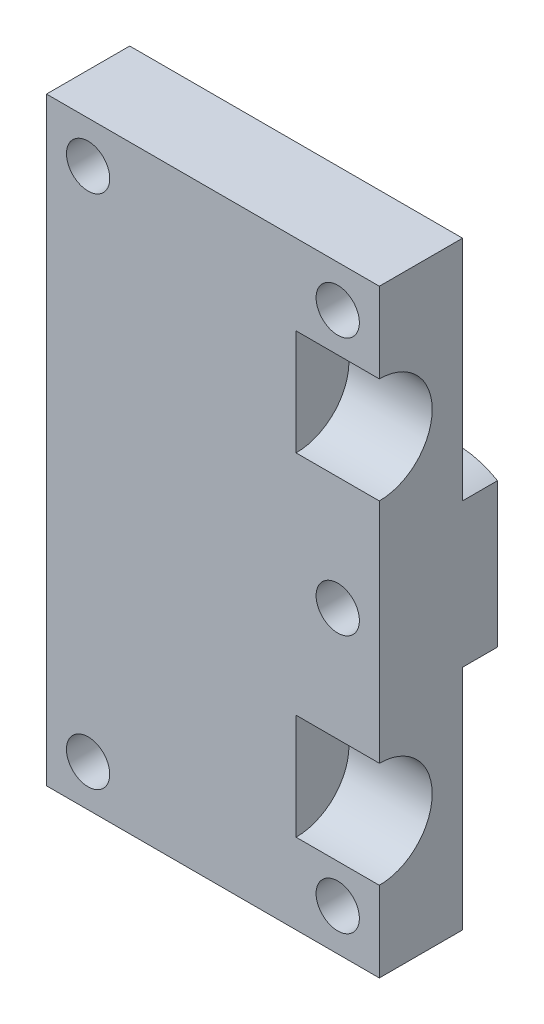
ISO-10303-21;
HEADER;
FILE_DESCRIPTION(('STEP AP214'),'2;1');
FILE_NAME('part.step','',(''),(''),'','','');
FILE_SCHEMA(('AUTOMOTIVE_DESIGN { 1 0 10303 214 1 1 1 1 }'));
ENDSEC;
DATA;
#1=APPLICATION_CONTEXT('core data for automotive mechanical design processes');
#2=APPLICATION_PROTOCOL_DEFINITION('international standard','automotive_design',2000,#1);
#3=PRODUCT_CONTEXT('',#1,'mechanical');
#4=PRODUCT('Part','Part','',(#3));
#5=PRODUCT_RELATED_PRODUCT_CATEGORY('part','',(#4));
#6=PRODUCT_DEFINITION_FORMATION('','',#4);
#7=PRODUCT_DEFINITION_CONTEXT('part definition',#1,'design');
#8=PRODUCT_DEFINITION('design','',#6,#7);
#9=PRODUCT_DEFINITION_SHAPE('','',#8);
#10=(LENGTH_UNIT() NAMED_UNIT(*) SI_UNIT(.MILLI.,.METRE.));
#11=(NAMED_UNIT(*) PLANE_ANGLE_UNIT() SI_UNIT($,.RADIAN.));
#12=(NAMED_UNIT(*) SI_UNIT($,.STERADIAN.) SOLID_ANGLE_UNIT());
#13=UNCERTAINTY_MEASURE_WITH_UNIT(LENGTH_MEASURE(1.E-05),#10,'distance_accuracy_value','');
#14=(GEOMETRIC_REPRESENTATION_CONTEXT(3) GLOBAL_UNCERTAINTY_ASSIGNED_CONTEXT((#13)) GLOBAL_UNIT_ASSIGNED_CONTEXT((#10,
#11,#12)) REPRESENTATION_CONTEXT('',''));
#15=CARTESIAN_POINT('',(0.,0.,0.));
#16=DIRECTION('',(0.,0.,1.));
#17=DIRECTION('',(1.,0.,0.));
#18=AXIS2_PLACEMENT_3D('',#15,#16,#17);
#19=CARTESIAN_POINT('',(0.,36.,0.));
#20=DIRECTION('',(1.,0.,0.));
#21=DIRECTION('',(0.,0.,-1.));
#22=AXIS2_PLACEMENT_3D('',#19,#20,#21);
#23=PLANE('',#22);
#24=DIRECTION('',(0.,0.,1.));
#25=VECTOR('',#24,1.);
#26=CARTESIAN_POINT('',(0.,-36.,0.));
#27=LINE('',#26,#25);
#28=CARTESIAN_POINT('',(0.,-36.,-10.));
#29=VERTEX_POINT('',#28);
#30=CARTESIAN_POINT('',(0.,-36.,0.));
#31=VERTEX_POINT('',#30);
#32=EDGE_CURVE('E181',#29,#31,#27,.T.);
#33=ORIENTED_EDGE('',*,*,#32,.T.);
#34=DIRECTION('',(0.,-1.,0.));
#35=VECTOR('',#34,1.);
#36=CARTESIAN_POINT('',(0.,36.,0.));
#37=LINE('',#36,#35);
#38=CARTESIAN_POINT('',(0.,36.,0.));
#39=VERTEX_POINT('',#38);
#40=EDGE_CURVE('E11',#39,#31,#37,.T.);
#41=ORIENTED_EDGE('',*,*,#40,.F.);
#42=DIRECTION('',(0.,0.,1.));
#43=VECTOR('',#42,1.);
#44=CARTESIAN_POINT('',(0.,36.,0.));
#45=LINE('',#44,#43);
#46=CARTESIAN_POINT('',(0.,36.,-10.));
#47=VERTEX_POINT('',#46);
#48=EDGE_CURVE('E184',#47,#39,#45,.T.);
#49=ORIENTED_EDGE('',*,*,#48,.F.);
#50=DIRECTION('',(0.,-1.,0.));
#51=VECTOR('',#50,1.);
#52=CARTESIAN_POINT('',(0.,36.,-10.));
#53=LINE('',#52,#51);
#54=EDGE_CURVE('E194',#47,#29,#53,.T.);
#55=ORIENTED_EDGE('',*,*,#54,.T.);
#56=EDGE_LOOP('',(#33,#41,#49,#55));
#57=FACE_BOUND('',#56,.T.);
#58=ADVANCED_FACE('F33',(#57),#23,.F.);
#59=CARTESIAN_POINT('',(0.,36.,0.));
#60=DIRECTION('',(0.,0.,-1.));
#61=DIRECTION('',(-1.,0.,0.));
#62=AXIS2_PLACEMENT_3D('',#59,#60,#61);
#63=PLANE('',#62);
#64=CARTESIAN_POINT('',(35.,0.,0.));
#65=DIRECTION('',(0.,0.,-1.));
#66=DIRECTION('',(-1.,0.,0.));
#67=AXIS2_PLACEMENT_3D('',#64,#65,#66);
#68=CIRCLE('',#67,2.6);
#69=CARTESIAN_POINT('',(32.4,0.,0.));
#70=VERTEX_POINT('',#69);
#71=EDGE_CURVE('E127',#70,#70,#68,.T.);
#72=ORIENTED_EDGE('',*,*,#71,.T.);
#73=EDGE_LOOP('',(#72));
#74=FACE_BOUND('',#73,.T.);
#75=CARTESIAN_POINT('',(5.,-31.,0.));
#76=DIRECTION('',(0.,0.,-1.));
#77=DIRECTION('',(-1.,0.,0.));
#78=AXIS2_PLACEMENT_3D('',#75,#76,#77);
#79=CIRCLE('',#78,2.6);
#80=CARTESIAN_POINT('',(2.4,-31.,0.));
#81=VERTEX_POINT('',#80);
#82=EDGE_CURVE('E135',#81,#81,#79,.T.);
#83=ORIENTED_EDGE('',*,*,#82,.T.);
#84=EDGE_LOOP('',(#83));
#85=FACE_BOUND('',#84,.T.);
#86=CARTESIAN_POINT('',(35.,-31.,0.));
#87=DIRECTION('',(0.,0.,-1.));
#88=DIRECTION('',(-1.,0.,0.));
#89=AXIS2_PLACEMENT_3D('',#86,#87,#88);
#90=CIRCLE('',#89,2.6);
#91=CARTESIAN_POINT('',(32.4,-31.,0.));
#92=VERTEX_POINT('',#91);
#93=EDGE_CURVE('E148',#92,#92,#90,.T.);
#94=ORIENTED_EDGE('',*,*,#93,.T.);
#95=EDGE_LOOP('',(#94));
#96=FACE_BOUND('',#95,.T.);
#97=CARTESIAN_POINT('',(5.,31.,0.));
#98=DIRECTION('',(0.,0.,-1.));
#99=DIRECTION('',(-1.,0.,0.));
#100=AXIS2_PLACEMENT_3D('',#97,#98,#99);
#101=CIRCLE('',#100,2.6);
#102=CARTESIAN_POINT('',(2.4,31.,0.));
#103=VERTEX_POINT('',#102);
#104=EDGE_CURVE('E141',#103,#103,#101,.T.);
#105=ORIENTED_EDGE('',*,*,#104,.T.);
#106=EDGE_LOOP('',(#105));
#107=FACE_BOUND('',#106,.T.);
#108=CARTESIAN_POINT('',(35.,31.,0.));
#109=DIRECTION('',(0.,0.,-1.));
#110=DIRECTION('',(-1.,0.,0.));
#111=AXIS2_PLACEMENT_3D('',#108,#109,#110);
#112=CIRCLE('',#111,2.6);
#113=CARTESIAN_POINT('',(32.4,31.,0.));
#114=VERTEX_POINT('',#113);
#115=EDGE_CURVE('E153',#114,#114,#112,.T.);
#116=ORIENTED_EDGE('',*,*,#115,.T.);
#117=EDGE_LOOP('',(#116));
#118=FACE_BOUND('',#117,.T.);
#119=DIRECTION('',(0.,-1.,0.));
#120=VECTOR('',#119,1.);
#121=CARTESIAN_POINT('',(30.,-13.65,0.));
#122=LINE('',#121,#120);
#123=CARTESIAN_POINT('',(30.,-13.65,0.));
#124=VERTEX_POINT('',#123);
#125=CARTESIAN_POINT('',(30.,-26.35,0.));
#126=VERTEX_POINT('',#125);
#127=EDGE_CURVE('E162',#124,#126,#122,.T.);
#128=ORIENTED_EDGE('',*,*,#127,.F.);
#129=DIRECTION('',(1.,0.,0.));
#130=VECTOR('',#129,1.);
#131=CARTESIAN_POINT('',(30.,-13.65,0.));
#132=LINE('',#131,#130);
#133=CARTESIAN_POINT('',(40.,-13.65,0.));
#134=VERTEX_POINT('',#133);
#135=EDGE_CURVE('E165',#124,#134,#132,.T.);
#136=ORIENTED_EDGE('',*,*,#135,.T.);
#137=DIRECTION('',(0.,-1.,0.));
#138=VECTOR('',#137,1.);
#139=CARTESIAN_POINT('',(40.,36.,0.));
#140=LINE('',#139,#138);
#141=CARTESIAN_POINT('',(40.,13.65,0.));
#142=VERTEX_POINT('',#141);
#143=EDGE_CURVE('E210',#142,#134,#140,.T.);
#144=ORIENTED_EDGE('',*,*,#143,.F.);
#145=DIRECTION('',(1.,0.,0.));
#146=VECTOR('',#145,1.);
#147=CARTESIAN_POINT('',(30.,13.65,0.));
#148=LINE('',#147,#146);
#149=CARTESIAN_POINT('',(30.,13.65,0.));
#150=VERTEX_POINT('',#149);
#151=EDGE_CURVE('E179',#150,#142,#148,.T.);
#152=ORIENTED_EDGE('',*,*,#151,.F.);
#153=DIRECTION('',(0.,-1.,0.));
#154=VECTOR('',#153,1.);
#155=CARTESIAN_POINT('',(30.,26.35,0.));
#156=LINE('',#155,#154);
#157=CARTESIAN_POINT('',(30.,26.35,0.));
#158=VERTEX_POINT('',#157);
#159=EDGE_CURVE('E174',#158,#150,#156,.T.);
#160=ORIENTED_EDGE('',*,*,#159,.F.);
#161=DIRECTION('',(1.,0.,0.));
#162=VECTOR('',#161,1.);
#163=CARTESIAN_POINT('',(30.,26.35,0.));
#164=LINE('',#163,#162);
#165=CARTESIAN_POINT('',(40.,26.35,0.));
#166=VERTEX_POINT('',#165);
#167=EDGE_CURVE('E177',#158,#166,#164,.T.);
#168=ORIENTED_EDGE('',*,*,#167,.T.);
#169=CARTESIAN_POINT('',(40.,36.,0.));
#170=VERTEX_POINT('',#169);
#171=EDGE_CURVE('E40',#170,#166,#140,.T.);
#172=ORIENTED_EDGE('',*,*,#171,.F.);
#173=DIRECTION('',(1.,0.,0.));
#174=VECTOR('',#173,1.);
#175=CARTESIAN_POINT('',(0.,36.,0.));
#176=LINE('',#175,#174);
#177=EDGE_CURVE('E187',#39,#170,#176,.T.);
#178=ORIENTED_EDGE('',*,*,#177,.F.);
#179=ORIENTED_EDGE('',*,*,#40,.T.);
#180=DIRECTION('',(1.,0.,0.));
#181=VECTOR('',#180,1.);
#182=CARTESIAN_POINT('',(0.,-36.,0.));
#183=LINE('',#182,#181);
#184=CARTESIAN_POINT('',(40.,-36.,0.));
#185=VERTEX_POINT('',#184);
#186=EDGE_CURVE('E197',#31,#185,#183,.T.);
#187=ORIENTED_EDGE('',*,*,#186,.T.);
#188=CARTESIAN_POINT('',(40.,-26.35,0.));
#189=VERTEX_POINT('',#188);
#190=EDGE_CURVE('E208',#189,#185,#140,.T.);
#191=ORIENTED_EDGE('',*,*,#190,.F.);
#192=DIRECTION('',(1.,0.,0.));
#193=VECTOR('',#192,1.);
#194=CARTESIAN_POINT('',(30.,-26.35,0.));
#195=LINE('',#194,#193);
#196=EDGE_CURVE('E55',#126,#189,#195,.T.);
#197=ORIENTED_EDGE('',*,*,#196,.F.);
#198=EDGE_LOOP('',(#128,#136,#144,#152,#160,#168,#172,#178,#179,#187,#191,#197));
#199=FACE_BOUND('',#198,.T.);
#200=ADVANCED_FACE('F219',(#74,#85,#96,#107,#118,#199),#63,.F.);
#201=CARTESIAN_POINT('',(40.,36.,0.));
#202=DIRECTION('',(-1.,0.,0.));
#203=DIRECTION('',(0.,0.,1.));
#204=AXIS2_PLACEMENT_3D('',#201,#202,#203);
#205=PLANE('',#204);
#206=ORIENTED_EDGE('',*,*,#143,.T.);
#207=CARTESIAN_POINT('',(40.,-20.,0.));
#208=DIRECTION('',(1.,0.,0.));
#209=DIRECTION('',(0.,0.,-1.));
#210=AXIS2_PLACEMENT_3D('',#207,#208,#209);
#211=CIRCLE('',#210,6.35);
#212=EDGE_CURVE('E156',#189,#134,#211,.T.);
#213=ORIENTED_EDGE('',*,*,#212,.F.);
#214=ORIENTED_EDGE('',*,*,#190,.T.);
#215=DIRECTION('',(0.,0.,-1.));
#216=VECTOR('',#215,1.);
#217=CARTESIAN_POINT('',(40.,-36.,0.));
#218=LINE('',#217,#216);
#219=CARTESIAN_POINT('',(40.,-36.,-10.));
#220=VERTEX_POINT('',#219);
#221=EDGE_CURVE('E200',#185,#220,#218,.T.);
#222=ORIENTED_EDGE('',*,*,#221,.T.);
#223=DIRECTION('',(0.,-1.,0.));
#224=VECTOR('',#223,1.);
#225=CARTESIAN_POINT('',(40.,36.,-10.));
#226=LINE('',#225,#224);
#227=CARTESIAN_POINT('',(40.,-8.66025403784439,-10.));
#228=VERTEX_POINT('',#227);
#229=EDGE_CURVE('E206',#228,#220,#226,.T.);
#230=ORIENTED_EDGE('',*,*,#229,.F.);
#231=DIRECTION('',(0.,0.,1.));
#232=VECTOR('',#231,1.);
#233=CARTESIAN_POINT('',(40.,-8.66025403784439,-14.2));
#234=LINE('',#233,#232);
#235=CARTESIAN_POINT('',(40.,-8.66025403784439,-14.2));
#236=VERTEX_POINT('',#235);
#237=EDGE_CURVE('E117',#236,#228,#234,.T.);
#238=ORIENTED_EDGE('',*,*,#237,.F.);
#239=DIRECTION('',(0.,-1.,0.));
#240=VECTOR('',#239,1.);
#241=CARTESIAN_POINT('',(40.,8.66025403784439,-14.2));
#242=LINE('',#241,#240);
#243=CARTESIAN_POINT('',(40.,8.66025403784439,-14.2));
#244=VERTEX_POINT('',#243);
#245=EDGE_CURVE('E109',#244,#236,#242,.T.);
#246=ORIENTED_EDGE('',*,*,#245,.F.);
#247=DIRECTION('',(0.,0.,1.));
#248=VECTOR('',#247,1.);
#249=CARTESIAN_POINT('',(40.,8.66025403784439,-14.2));
#250=LINE('',#249,#248);
#251=CARTESIAN_POINT('',(40.,8.66025403784439,-10.));
#252=VERTEX_POINT('',#251);
#253=EDGE_CURVE('E115',#244,#252,#250,.T.);
#254=ORIENTED_EDGE('',*,*,#253,.T.);
#255=CARTESIAN_POINT('',(40.,36.,-10.));
#256=VERTEX_POINT('',#255);
#257=EDGE_CURVE('E207',#256,#252,#226,.T.);
#258=ORIENTED_EDGE('',*,*,#257,.F.);
#259=DIRECTION('',(0.,0.,-1.));
#260=VECTOR('',#259,1.);
#261=CARTESIAN_POINT('',(40.,36.,0.));
#262=LINE('',#261,#260);
#263=EDGE_CURVE('E190',#170,#256,#262,.T.);
#264=ORIENTED_EDGE('',*,*,#263,.F.);
#265=ORIENTED_EDGE('',*,*,#171,.T.);
#266=CARTESIAN_POINT('',(40.,20.,0.));
#267=DIRECTION('',(1.,0.,0.));
#268=DIRECTION('',(0.,0.,-1.));
#269=AXIS2_PLACEMENT_3D('',#266,#267,#268);
#270=CIRCLE('',#269,6.35);
#271=EDGE_CURVE('E168',#142,#166,#270,.T.);
#272=ORIENTED_EDGE('',*,*,#271,.F.);
#273=EDGE_LOOP('',(#206,#213,#214,#222,#230,#238,#246,#254,#258,#264,#265,#272));
#274=FACE_BOUND('',#273,.T.);
#275=ADVANCED_FACE('F112',(#274),#205,.F.);
#276=CARTESIAN_POINT('',(0.,36.,-10.));
#277=DIRECTION('',(0.,0.,1.));
#278=DIRECTION('',(1.,0.,0.));
#279=AXIS2_PLACEMENT_3D('',#276,#277,#278);
#280=PLANE('',#279);
#281=CARTESIAN_POINT('',(35.,0.,-10.));
#282=DIRECTION('',(0.,0.,-1.));
#283=DIRECTION('',(-1.,0.,0.));
#284=AXIS2_PLACEMENT_3D('',#281,#282,#283);
#285=CIRCLE('',#284,10.);
#286=EDGE_CURVE('E47',#228,#252,#285,.T.);
#287=ORIENTED_EDGE('',*,*,#286,.F.);
#288=ORIENTED_EDGE('',*,*,#229,.T.);
#289=DIRECTION('',(-1.,0.,0.));
#290=VECTOR('',#289,1.);
#291=CARTESIAN_POINT('',(0.,-36.,-10.));
#292=LINE('',#291,#290);
#293=EDGE_CURVE('E188',#220,#29,#292,.T.);
#294=ORIENTED_EDGE('',*,*,#293,.T.);
#295=ORIENTED_EDGE('',*,*,#54,.F.);
#296=DIRECTION('',(-1.,0.,0.));
#297=VECTOR('',#296,1.);
#298=CARTESIAN_POINT('',(0.,36.,-10.));
#299=LINE('',#298,#297);
#300=EDGE_CURVE('E192',#256,#47,#299,.T.);
#301=ORIENTED_EDGE('',*,*,#300,.F.);
#302=ORIENTED_EDGE('',*,*,#257,.T.);
#303=EDGE_LOOP('',(#287,#288,#294,#295,#301,#302));
#304=FACE_BOUND('',#303,.T.);
#305=CARTESIAN_POINT('',(5.,-31.,-10.));
#306=DIRECTION('',(0.,0.,-1.));
#307=DIRECTION('',(-1.,0.,0.));
#308=AXIS2_PLACEMENT_3D('',#305,#306,#307);
#309=CIRCLE('',#308,2.6);
#310=CARTESIAN_POINT('',(2.4,-31.,-10.));
#311=VERTEX_POINT('',#310);
#312=EDGE_CURVE('E130',#311,#311,#309,.T.);
#313=ORIENTED_EDGE('',*,*,#312,.F.);
#314=EDGE_LOOP('',(#313));
#315=FACE_BOUND('',#314,.T.);
#316=CARTESIAN_POINT('',(35.,-31.,-10.));
#317=DIRECTION('',(0.,0.,-1.));
#318=DIRECTION('',(-1.,0.,0.));
#319=AXIS2_PLACEMENT_3D('',#316,#317,#318);
#320=CIRCLE('',#319,2.6);
#321=CARTESIAN_POINT('',(32.4,-31.,-10.));
#322=VERTEX_POINT('',#321);
#323=EDGE_CURVE('E138',#322,#322,#320,.T.);
#324=ORIENTED_EDGE('',*,*,#323,.F.);
#325=EDGE_LOOP('',(#324));
#326=FACE_BOUND('',#325,.T.);
#327=CARTESIAN_POINT('',(5.,31.,-10.));
#328=DIRECTION('',(0.,0.,-1.));
#329=DIRECTION('',(-1.,0.,0.));
#330=AXIS2_PLACEMENT_3D('',#327,#328,#329);
#331=CIRCLE('',#330,2.6);
#332=CARTESIAN_POINT('',(2.4,31.,-10.));
#333=VERTEX_POINT('',#332);
#334=EDGE_CURVE('E145',#333,#333,#331,.T.);
#335=ORIENTED_EDGE('',*,*,#334,.F.);
#336=EDGE_LOOP('',(#335));
#337=FACE_BOUND('',#336,.T.);
#338=CARTESIAN_POINT('',(35.,31.,-10.));
#339=DIRECTION('',(0.,0.,-1.));
#340=DIRECTION('',(-1.,0.,0.));
#341=AXIS2_PLACEMENT_3D('',#338,#339,#340);
#342=CIRCLE('',#341,2.6);
#343=CARTESIAN_POINT('',(32.4,31.,-10.));
#344=VERTEX_POINT('',#343);
#345=EDGE_CURVE('E144',#344,#344,#342,.T.);
#346=ORIENTED_EDGE('',*,*,#345,.F.);
#347=EDGE_LOOP('',(#346));
#348=FACE_BOUND('',#347,.T.);
#349=ADVANCED_FACE('F225',(#304,#315,#326,#337,#348),#280,.F.);
#350=CARTESIAN_POINT('',(0.,36.,0.));
#351=DIRECTION('',(0.,-1.,0.));
#352=DIRECTION('',(0.,0.,-1.));
#353=AXIS2_PLACEMENT_3D('',#350,#351,#352);
#354=PLANE('',#353);
#355=ORIENTED_EDGE('',*,*,#48,.T.);
#356=ORIENTED_EDGE('',*,*,#177,.T.);
#357=ORIENTED_EDGE('',*,*,#263,.T.);
#358=ORIENTED_EDGE('',*,*,#300,.T.);
#359=EDGE_LOOP('',(#355,#356,#357,#358));
#360=FACE_BOUND('',#359,.T.);
#361=ADVANCED_FACE('F231',(#360),#354,.F.);
#362=CARTESIAN_POINT('',(0.,-36.,0.));
#363=DIRECTION('',(0.,-1.,0.));
#364=DIRECTION('',(0.,0.,-1.));
#365=AXIS2_PLACEMENT_3D('',#362,#363,#364);
#366=PLANE('',#365);
#367=ORIENTED_EDGE('',*,*,#32,.F.);
#368=ORIENTED_EDGE('',*,*,#293,.F.);
#369=ORIENTED_EDGE('',*,*,#221,.F.);
#370=ORIENTED_EDGE('',*,*,#186,.F.);
#371=EDGE_LOOP('',(#367,#368,#369,#370));
#372=FACE_BOUND('',#371,.T.);
#373=ADVANCED_FACE('F223',(#372),#366,.T.);
#374=CARTESIAN_POINT('',(30.,20.,0.));
#375=DIRECTION('',(1.,0.,0.));
#376=DIRECTION('',(0.,0.,-1.));
#377=AXIS2_PLACEMENT_3D('',#374,#375,#376);
#378=CYLINDRICAL_SURFACE('',#377,6.35);
#379=ORIENTED_EDGE('',*,*,#271,.T.);
#380=ORIENTED_EDGE('',*,*,#167,.F.);
#381=CARTESIAN_POINT('',(30.,20.,0.));
#382=DIRECTION('',(1.,0.,0.));
#383=DIRECTION('',(0.,0.,-1.));
#384=AXIS2_PLACEMENT_3D('',#381,#382,#383);
#385=CIRCLE('',#384,6.35);
#386=EDGE_CURVE('E171',#150,#158,#385,.T.);
#387=ORIENTED_EDGE('',*,*,#386,.F.);
#388=ORIENTED_EDGE('',*,*,#151,.T.);
#389=EDGE_LOOP('',(#379,#380,#387,#388));
#390=FACE_BOUND('',#389,.T.);
#391=ADVANCED_FACE('F235',(#390),#378,.F.);
#392=CARTESIAN_POINT('',(30.,20.,0.));
#393=DIRECTION('',(1.,0.,0.));
#394=DIRECTION('',(0.,0.,-1.));
#395=AXIS2_PLACEMENT_3D('',#392,#393,#394);
#396=PLANE('',#395);
#397=ORIENTED_EDGE('',*,*,#386,.T.);
#398=ORIENTED_EDGE('',*,*,#159,.T.);
#399=EDGE_LOOP('',(#397,#398));
#400=FACE_BOUND('',#399,.T.);
#401=ADVANCED_FACE('F237',(#400),#396,.T.);
#402=CARTESIAN_POINT('',(30.,-20.,0.));
#403=DIRECTION('',(1.,0.,0.));
#404=DIRECTION('',(0.,0.,-1.));
#405=AXIS2_PLACEMENT_3D('',#402,#403,#404);
#406=CYLINDRICAL_SURFACE('',#405,6.35);
#407=ORIENTED_EDGE('',*,*,#212,.T.);
#408=ORIENTED_EDGE('',*,*,#135,.F.);
#409=CARTESIAN_POINT('',(30.,-20.,0.));
#410=DIRECTION('',(1.,0.,0.));
#411=DIRECTION('',(0.,0.,-1.));
#412=AXIS2_PLACEMENT_3D('',#409,#410,#411);
#413=CIRCLE('',#412,6.35);
#414=EDGE_CURVE('E159',#126,#124,#413,.T.);
#415=ORIENTED_EDGE('',*,*,#414,.F.);
#416=ORIENTED_EDGE('',*,*,#196,.T.);
#417=EDGE_LOOP('',(#407,#408,#415,#416));
#418=FACE_BOUND('',#417,.T.);
#419=ADVANCED_FACE('F239',(#418),#406,.F.);
#420=CARTESIAN_POINT('',(30.,-20.,0.));
#421=DIRECTION('',(1.,0.,0.));
#422=DIRECTION('',(0.,0.,-1.));
#423=AXIS2_PLACEMENT_3D('',#420,#421,#422);
#424=PLANE('',#423);
#425=ORIENTED_EDGE('',*,*,#414,.T.);
#426=ORIENTED_EDGE('',*,*,#127,.T.);
#427=EDGE_LOOP('',(#425,#426));
#428=FACE_BOUND('',#427,.T.);
#429=ADVANCED_FACE('F241',(#428),#424,.T.);
#430=CARTESIAN_POINT('',(35.,31.,0.));
#431=DIRECTION('',(0.,0.,-1.));
#432=DIRECTION('',(-1.,0.,0.));
#433=AXIS2_PLACEMENT_3D('',#430,#431,#432);
#434=CYLINDRICAL_SURFACE('',#433,2.6);
#435=ORIENTED_EDGE('',*,*,#115,.F.);
#436=EDGE_LOOP('',(#435));
#437=FACE_BOUND('',#436,.T.);
#438=ORIENTED_EDGE('',*,*,#345,.T.);
#439=EDGE_LOOP('',(#438));
#440=FACE_BOUND('',#439,.T.);
#441=ADVANCED_FACE('F243',(#437,#440),#434,.F.);
#442=CARTESIAN_POINT('',(5.,31.,0.));
#443=DIRECTION('',(0.,0.,-1.));
#444=DIRECTION('',(-1.,0.,0.));
#445=AXIS2_PLACEMENT_3D('',#442,#443,#444);
#446=CYLINDRICAL_SURFACE('',#445,2.6);
#447=ORIENTED_EDGE('',*,*,#104,.F.);
#448=EDGE_LOOP('',(#447));
#449=FACE_BOUND('',#448,.T.);
#450=ORIENTED_EDGE('',*,*,#334,.T.);
#451=EDGE_LOOP('',(#450));
#452=FACE_BOUND('',#451,.T.);
#453=ADVANCED_FACE('F249',(#449,#452),#446,.F.);
#454=CARTESIAN_POINT('',(35.,-31.,0.));
#455=DIRECTION('',(0.,0.,-1.));
#456=DIRECTION('',(-1.,0.,0.));
#457=AXIS2_PLACEMENT_3D('',#454,#455,#456);
#458=CYLINDRICAL_SURFACE('',#457,2.6);
#459=ORIENTED_EDGE('',*,*,#93,.F.);
#460=EDGE_LOOP('',(#459));
#461=FACE_BOUND('',#460,.T.);
#462=ORIENTED_EDGE('',*,*,#323,.T.);
#463=EDGE_LOOP('',(#462));
#464=FACE_BOUND('',#463,.T.);
#465=ADVANCED_FACE('F300',(#461,#464),#458,.F.);
#466=CARTESIAN_POINT('',(5.,-31.,0.));
#467=DIRECTION('',(0.,0.,-1.));
#468=DIRECTION('',(-1.,0.,0.));
#469=AXIS2_PLACEMENT_3D('',#466,#467,#468);
#470=CYLINDRICAL_SURFACE('',#469,2.6);
#471=ORIENTED_EDGE('',*,*,#82,.F.);
#472=EDGE_LOOP('',(#471));
#473=FACE_BOUND('',#472,.T.);
#474=ORIENTED_EDGE('',*,*,#312,.T.);
#475=EDGE_LOOP('',(#474));
#476=FACE_BOUND('',#475,.T.);
#477=ADVANCED_FACE('F309',(#473,#476),#470,.F.);
#478=CARTESIAN_POINT('',(35.,0.,0.));
#479=DIRECTION('',(0.,0.,-1.));
#480=DIRECTION('',(-1.,0.,0.));
#481=AXIS2_PLACEMENT_3D('',#478,#479,#480);
#482=CYLINDRICAL_SURFACE('',#481,2.6);
#483=ORIENTED_EDGE('',*,*,#71,.F.);
#484=EDGE_LOOP('',(#483));
#485=FACE_BOUND('',#484,.T.);
#486=CARTESIAN_POINT('',(35.,0.,-14.2));
#487=DIRECTION('',(0.,0.,-1.));
#488=DIRECTION('',(-1.,0.,0.));
#489=AXIS2_PLACEMENT_3D('',#486,#487,#488);
#490=CIRCLE('',#489,2.6);
#491=CARTESIAN_POINT('',(32.4,0.,-14.2));
#492=VERTEX_POINT('',#491);
#493=EDGE_CURVE('E398',#492,#492,#490,.T.);
#494=ORIENTED_EDGE('',*,*,#493,.T.);
#495=EDGE_LOOP('',(#494));
#496=FACE_BOUND('',#495,.T.);
#497=ADVANCED_FACE('F318',(#485,#496),#482,.F.);
#498=CARTESIAN_POINT('',(35.,0.,-14.2));
#499=DIRECTION('',(0.,0.,-1.));
#500=DIRECTION('',(-1.,0.,0.));
#501=AXIS2_PLACEMENT_3D('',#498,#499,#500);
#502=PLANE('',#501);
#503=CARTESIAN_POINT('',(35.,0.,-14.2));
#504=DIRECTION('',(0.,0.,-1.));
#505=DIRECTION('',(-1.,0.,0.));
#506=AXIS2_PLACEMENT_3D('',#503,#504,#505);
#507=CIRCLE('',#506,10.);
#508=EDGE_CURVE('E120',#236,#244,#507,.T.);
#509=ORIENTED_EDGE('',*,*,#508,.T.);
#510=ORIENTED_EDGE('',*,*,#245,.T.);
#511=EDGE_LOOP('',(#509,#510));
#512=FACE_BOUND('',#511,.T.);
#513=ORIENTED_EDGE('',*,*,#493,.F.);
#514=EDGE_LOOP('',(#513));
#515=FACE_BOUND('',#514,.T.);
#516=ADVANCED_FACE('F122',(#512,#515),#502,.T.);
#517=CARTESIAN_POINT('',(35.,0.,-14.2));
#518=DIRECTION('',(0.,0.,1.));
#519=DIRECTION('',(1.,0.,0.));
#520=AXIS2_PLACEMENT_3D('',#517,#518,#519);
#521=CYLINDRICAL_SURFACE('',#520,10.);
#522=ORIENTED_EDGE('',*,*,#286,.T.);
#523=ORIENTED_EDGE('',*,*,#253,.F.);
#524=ORIENTED_EDGE('',*,*,#508,.F.);
#525=ORIENTED_EDGE('',*,*,#237,.T.);
#526=EDGE_LOOP('',(#522,#523,#524,#525));
#527=FACE_BOUND('',#526,.T.);
#528=ADVANCED_FACE('F126',(#527),#521,.T.);
#529=CLOSED_SHELL('',(#58,#200,#275,#349,#361,#373,#391,#401,#419,#429,#441,#453,#465,#477,#497,
#516,#528));
#530=MANIFOLD_SOLID_BREP('B2',#529);
#531=ADVANCED_BREP_SHAPE_REPRESENTATION('',(#18,#530),#14);
#532=SHAPE_DEFINITION_REPRESENTATION(#9,#531);
ENDSEC;
END-ISO-10303-21;
